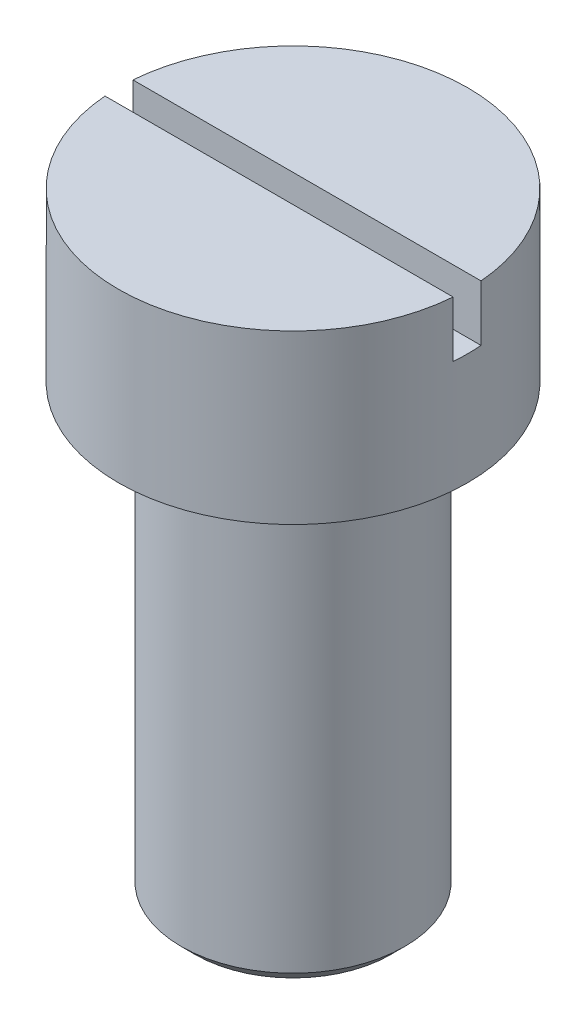
ISO-10303-21;
HEADER;
FILE_DESCRIPTION(('STEP AP214'),'2;1');
FILE_NAME('part.step','',(''),(''),'','','');
FILE_SCHEMA(('AUTOMOTIVE_DESIGN { 1 0 10303 214 1 1 1 1 }'));
ENDSEC;
DATA;
#1=APPLICATION_CONTEXT('core data for automotive mechanical design processes');
#2=APPLICATION_PROTOCOL_DEFINITION('international standard','automotive_design',2000,#1);
#3=PRODUCT_CONTEXT('',#1,'mechanical');
#4=PRODUCT('Part','Part','',(#3));
#5=PRODUCT_RELATED_PRODUCT_CATEGORY('part','',(#4));
#6=PRODUCT_DEFINITION_FORMATION('','',#4);
#7=PRODUCT_DEFINITION_CONTEXT('part definition',#1,'design');
#8=PRODUCT_DEFINITION('design','',#6,#7);
#9=PRODUCT_DEFINITION_SHAPE('','',#8);
#10=(LENGTH_UNIT() NAMED_UNIT(*) SI_UNIT(.MILLI.,.METRE.));
#11=(NAMED_UNIT(*) PLANE_ANGLE_UNIT() SI_UNIT($,.RADIAN.));
#12=(NAMED_UNIT(*) SI_UNIT($,.STERADIAN.) SOLID_ANGLE_UNIT());
#13=UNCERTAINTY_MEASURE_WITH_UNIT(LENGTH_MEASURE(1.E-05),#10,'distance_accuracy_value','');
#14=(GEOMETRIC_REPRESENTATION_CONTEXT(3) GLOBAL_UNCERTAINTY_ASSIGNED_CONTEXT((#13)) GLOBAL_UNIT_ASSIGNED_CONTEXT((#10,
#11,#12)) REPRESENTATION_CONTEXT('',''));
#15=CARTESIAN_POINT('',(0.,0.,0.));
#16=DIRECTION('',(0.,0.,1.));
#17=DIRECTION('',(1.,0.,0.));
#18=AXIS2_PLACEMENT_3D('',#15,#16,#17);
#19=CARTESIAN_POINT('',(0.,12.,0.));
#20=DIRECTION('',(0.,-1.,0.));
#21=DIRECTION('',(0.,0.,-1.));
#22=AXIS2_PLACEMENT_3D('',#19,#20,#21);
#23=CYLINDRICAL_SURFACE('',#22,12.5);
#24=CARTESIAN_POINT('',(0.,0.,0.));
#25=DIRECTION('',(0.,1.,0.));
#26=DIRECTION('',(0.,0.,1.));
#27=AXIS2_PLACEMENT_3D('',#24,#25,#26);
#28=CIRCLE('',#27,12.5);
#29=CARTESIAN_POINT('',(0.,0.,12.5));
#30=VERTEX_POINT('',#29);
#31=EDGE_CURVE('E115',#30,#30,#28,.T.);
#32=ORIENTED_EDGE('',*,*,#31,.T.);
#33=EDGE_LOOP('',(#32));
#34=FACE_BOUND('',#33,.T.);
#35=DIRECTION('',(0.,-1.,0.));
#36=VECTOR('',#35,1.);
#37=CARTESIAN_POINT('',(-12.4599357943771,12.,1.));
#38=LINE('',#37,#36);
#39=CARTESIAN_POINT('',(-12.4599357943771,8.,1.));
#40=VERTEX_POINT('',#39);
#41=CARTESIAN_POINT('',(-12.4599357943771,12.,1.));
#42=VERTEX_POINT('',#41);
#43=EDGE_CURVE('E61',#40,#42,#38,.F.);
#44=ORIENTED_EDGE('',*,*,#43,.F.);
#45=CARTESIAN_POINT('',(0.,8.,0.));
#46=DIRECTION('',(0.,1.,0.));
#47=DIRECTION('',(0.,0.,1.));
#48=AXIS2_PLACEMENT_3D('',#45,#46,#47);
#49=CIRCLE('',#48,12.5);
#50=CARTESIAN_POINT('',(-12.4599357943771,8.,-0.999999999999999));
#51=VERTEX_POINT('',#50);
#52=EDGE_CURVE('E65',#51,#40,#49,.T.);
#53=ORIENTED_EDGE('',*,*,#52,.F.);
#54=DIRECTION('',(0.,-1.,0.));
#55=VECTOR('',#54,1.);
#56=CARTESIAN_POINT('',(-12.4599357943771,12.,-0.999999999999999));
#57=LINE('',#56,#55);
#58=CARTESIAN_POINT('',(-12.4599357943771,12.,-0.999999999999999));
#59=VERTEX_POINT('',#58);
#60=EDGE_CURVE('E89',#59,#51,#57,.T.);
#61=ORIENTED_EDGE('',*,*,#60,.F.);
#62=CARTESIAN_POINT('',(0.,12.,0.));
#63=DIRECTION('',(0.,1.,0.));
#64=DIRECTION('',(0.,0.,1.));
#65=AXIS2_PLACEMENT_3D('',#62,#63,#64);
#66=CIRCLE('',#65,12.5);
#67=CARTESIAN_POINT('',(12.4599357943771,12.,-0.999999999999999));
#68=VERTEX_POINT('',#67);
#69=EDGE_CURVE('E84',#68,#59,#66,.T.);
#70=ORIENTED_EDGE('',*,*,#69,.F.);
#71=DIRECTION('',(0.,-1.,0.));
#72=VECTOR('',#71,1.);
#73=CARTESIAN_POINT('',(12.4599357943771,12.,-0.999999999999999));
#74=LINE('',#73,#72);
#75=CARTESIAN_POINT('',(12.4599357943771,8.,-0.999999999999999));
#76=VERTEX_POINT('',#75);
#77=EDGE_CURVE('E87',#76,#68,#74,.F.);
#78=ORIENTED_EDGE('',*,*,#77,.F.);
#79=CARTESIAN_POINT('',(12.4599357943771,8.,1.));
#80=VERTEX_POINT('',#79);
#81=EDGE_CURVE('E121',#80,#76,#49,.T.);
#82=ORIENTED_EDGE('',*,*,#81,.F.);
#83=DIRECTION('',(0.,-1.,0.));
#84=VECTOR('',#83,1.);
#85=CARTESIAN_POINT('',(12.4599357943771,12.,1.));
#86=LINE('',#85,#84);
#87=CARTESIAN_POINT('',(12.4599357943771,12.,1.));
#88=VERTEX_POINT('',#87);
#89=EDGE_CURVE('E112',#88,#80,#86,.T.);
#90=ORIENTED_EDGE('',*,*,#89,.F.);
#91=EDGE_CURVE('E93',#42,#88,#66,.T.);
#92=ORIENTED_EDGE('',*,*,#91,.F.);
#93=EDGE_LOOP('',(#44,#53,#61,#70,#78,#82,#90,#92));
#94=FACE_BOUND('',#93,.T.);
#95=ADVANCED_FACE('F45',(#34,#94),#23,.T.);
#96=CARTESIAN_POINT('',(0.,12.,0.));
#97=DIRECTION('',(0.,1.,0.));
#98=DIRECTION('',(0.,0.,1.));
#99=AXIS2_PLACEMENT_3D('',#96,#97,#98);
#100=PLANE('',#99);
#101=ORIENTED_EDGE('',*,*,#91,.T.);
#102=DIRECTION('',(-1.,0.,0.));
#103=VECTOR('',#102,1.);
#104=CARTESIAN_POINT('',(70.5558289583504,12.,1.));
#105=LINE('',#104,#103);
#106=EDGE_CURVE('E98',#88,#42,#105,.T.);
#107=ORIENTED_EDGE('',*,*,#106,.T.);
#108=EDGE_LOOP('',(#101,#107));
#109=FACE_BOUND('',#108,.T.);
#110=ADVANCED_FACE('F132',(#109),#100,.T.);
#111=DIRECTION('',(-1.,0.,0.));
#112=VECTOR('',#111,1.);
#113=CARTESIAN_POINT('',(70.5558289583504,12.,-0.999999999999999));
#114=LINE('',#113,#112);
#115=EDGE_CURVE('E95',#68,#59,#114,.T.);
#116=ORIENTED_EDGE('',*,*,#115,.F.);
#117=ORIENTED_EDGE('',*,*,#69,.T.);
#118=EDGE_LOOP('',(#116,#117));
#119=FACE_BOUND('',#118,.T.);
#120=ADVANCED_FACE('F96',(#119),#100,.T.);
#121=CARTESIAN_POINT('',(0.,0.,0.));
#122=DIRECTION('',(0.,1.,0.));
#123=DIRECTION('',(0.,0.,1.));
#124=AXIS2_PLACEMENT_3D('',#121,#122,#123);
#125=PLANE('',#124);
#126=CARTESIAN_POINT('',(0.,0.,0.));
#127=DIRECTION('',(0.,-1.,0.));
#128=DIRECTION('',(0.,0.,-1.));
#129=AXIS2_PLACEMENT_3D('',#126,#127,#128);
#130=CIRCLE('',#129,8.);
#131=CARTESIAN_POINT('',(0.,0.,-8.));
#132=VERTEX_POINT('',#131);
#133=EDGE_CURVE('E92',#132,#132,#130,.T.);
#134=ORIENTED_EDGE('',*,*,#133,.F.);
#135=EDGE_LOOP('',(#134));
#136=FACE_BOUND('',#135,.T.);
#137=ORIENTED_EDGE('',*,*,#31,.F.);
#138=EDGE_LOOP('',(#137));
#139=FACE_BOUND('',#138,.T.);
#140=ADVANCED_FACE('F139',(#136,#139),#125,.F.);
#141=CARTESIAN_POINT('',(0.,-32.,0.));
#142=DIRECTION('',(0.,1.,0.));
#143=DIRECTION('',(0.,0.,1.));
#144=AXIS2_PLACEMENT_3D('',#141,#142,#143);
#145=CYLINDRICAL_SURFACE('',#144,8.);
#146=CARTESIAN_POINT('',(0.,-31.,0.));
#147=DIRECTION('',(0.,-1.,0.));
#148=DIRECTION('',(0.,0.,-1.));
#149=AXIS2_PLACEMENT_3D('',#146,#147,#148);
#150=CIRCLE('',#149,8.);
#151=CARTESIAN_POINT('',(0.,-31.,-8.));
#152=VERTEX_POINT('',#151);
#153=EDGE_CURVE('E11',#152,#152,#150,.F.);
#154=ORIENTED_EDGE('',*,*,#153,.T.);
#155=EDGE_LOOP('',(#154));
#156=FACE_BOUND('',#155,.T.);
#157=ORIENTED_EDGE('',*,*,#133,.T.);
#158=EDGE_LOOP('',(#157));
#159=FACE_BOUND('',#158,.T.);
#160=ADVANCED_FACE('F143',(#156,#159),#145,.T.);
#161=CARTESIAN_POINT('',(0.,-32.,0.));
#162=DIRECTION('',(0.,-1.,0.));
#163=DIRECTION('',(0.,0.,-1.));
#164=AXIS2_PLACEMENT_3D('',#161,#162,#163);
#165=PLANE('',#164);
#166=CARTESIAN_POINT('',(0.,-32.,0.));
#167=DIRECTION('',(0.,-1.,0.));
#168=DIRECTION('',(0.,0.,-1.));
#169=AXIS2_PLACEMENT_3D('',#166,#167,#168);
#170=CIRCLE('',#169,7.00000000000001);
#171=CARTESIAN_POINT('',(0.,-32.,-7.00000000000001));
#172=VERTEX_POINT('',#171);
#173=EDGE_CURVE('E54',#172,#172,#170,.T.);
#174=ORIENTED_EDGE('',*,*,#173,.T.);
#175=EDGE_LOOP('',(#174));
#176=FACE_BOUND('',#175,.T.);
#177=ADVANCED_FACE('F150',(#176),#165,.T.);
#178=CARTESIAN_POINT('',(70.5558289583504,8.,1.));
#179=DIRECTION('',(0.,1.,0.));
#180=DIRECTION('',(0.,0.,1.));
#181=AXIS2_PLACEMENT_3D('',#178,#179,#180);
#182=PLANE('',#181);
#183=DIRECTION('',(-1.,0.,0.));
#184=VECTOR('',#183,1.);
#185=CARTESIAN_POINT('',(70.5558289583504,8.,1.));
#186=LINE('',#185,#184);
#187=EDGE_CURVE('E104',#80,#40,#186,.T.);
#188=ORIENTED_EDGE('',*,*,#187,.F.);
#189=ORIENTED_EDGE('',*,*,#81,.T.);
#190=DIRECTION('',(-1.,0.,0.));
#191=VECTOR('',#190,1.);
#192=CARTESIAN_POINT('',(70.5558289583504,8.,-0.999999999999999));
#193=LINE('',#192,#191);
#194=EDGE_CURVE('E103',#76,#51,#193,.T.);
#195=ORIENTED_EDGE('',*,*,#194,.T.);
#196=ORIENTED_EDGE('',*,*,#52,.T.);
#197=EDGE_LOOP('',(#188,#189,#195,#196));
#198=FACE_BOUND('',#197,.T.);
#199=ADVANCED_FACE('F127',(#198),#182,.T.);
#200=CARTESIAN_POINT('',(70.5558289583504,12.,1.));
#201=DIRECTION('',(0.,0.,-1.));
#202=DIRECTION('',(-1.,0.,0.));
#203=AXIS2_PLACEMENT_3D('',#200,#201,#202);
#204=PLANE('',#203);
#205=ORIENTED_EDGE('',*,*,#106,.F.);
#206=ORIENTED_EDGE('',*,*,#89,.T.);
#207=ORIENTED_EDGE('',*,*,#187,.T.);
#208=ORIENTED_EDGE('',*,*,#43,.T.);
#209=EDGE_LOOP('',(#205,#206,#207,#208));
#210=FACE_BOUND('',#209,.T.);
#211=ADVANCED_FACE('F130',(#210),#204,.T.);
#212=CARTESIAN_POINT('',(70.5558289583504,8.,-0.999999999999999));
#213=DIRECTION('',(0.,0.,1.));
#214=DIRECTION('',(1.,0.,0.));
#215=AXIS2_PLACEMENT_3D('',#212,#213,#214);
#216=PLANE('',#215);
#217=ORIENTED_EDGE('',*,*,#115,.T.);
#218=ORIENTED_EDGE('',*,*,#60,.T.);
#219=ORIENTED_EDGE('',*,*,#194,.F.);
#220=ORIENTED_EDGE('',*,*,#77,.T.);
#221=EDGE_LOOP('',(#217,#218,#219,#220));
#222=FACE_BOUND('',#221,.T.);
#223=ADVANCED_FACE('F101',(#222),#216,.T.);
#224=CARTESIAN_POINT('',(0.,-32.,0.));
#225=DIRECTION('',(0.,1.,0.));
#226=DIRECTION('',(0.,0.,1.));
#227=AXIS2_PLACEMENT_3D('',#224,#225,#226);
#228=CONICAL_SURFACE('',#227,7.00000000000001,0.785398163397445);
#229=ORIENTED_EDGE('',*,*,#153,.F.);
#230=EDGE_LOOP('',(#229));
#231=FACE_BOUND('',#230,.T.);
#232=ORIENTED_EDGE('',*,*,#173,.F.);
#233=EDGE_LOOP('',(#232));
#234=FACE_BOUND('',#233,.T.);
#235=ADVANCED_FACE('F48',(#231,#234),#228,.T.);
#236=CLOSED_SHELL('',(#95,#110,#120,#140,#160,#177,#199,#211,#223,#235));
#237=MANIFOLD_SOLID_BREP('B2',#236);
#238=ADVANCED_BREP_SHAPE_REPRESENTATION('',(#18,#237),#14);
#239=SHAPE_DEFINITION_REPRESENTATION(#9,#238);
ENDSEC;
END-ISO-10303-21;
